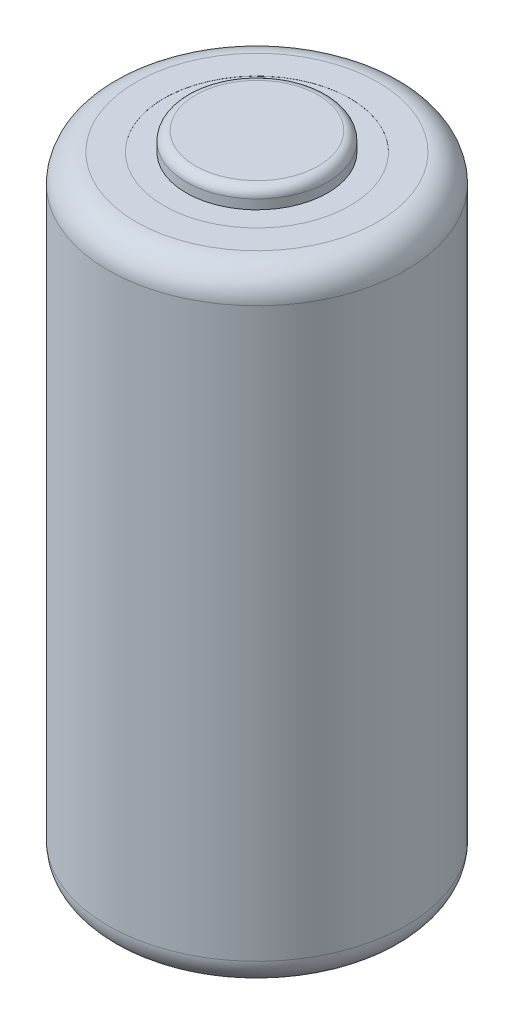
ISO-10303-21;
HEADER;
FILE_DESCRIPTION(('STEP AP214'),'2;1');
FILE_NAME('part.step','',(''),(''),'','','');
FILE_SCHEMA(('AUTOMOTIVE_DESIGN { 1 0 10303 214 1 1 1 1 }'));
ENDSEC;
DATA;
#1=APPLICATION_CONTEXT('core data for automotive mechanical design processes');
#2=APPLICATION_PROTOCOL_DEFINITION('international standard','automotive_design',2000,#1);
#3=PRODUCT_CONTEXT('',#1,'mechanical');
#4=PRODUCT('Part','Part','',(#3));
#5=PRODUCT_RELATED_PRODUCT_CATEGORY('part','',(#4));
#6=PRODUCT_DEFINITION_FORMATION('','',#4);
#7=PRODUCT_DEFINITION_CONTEXT('part definition',#1,'design');
#8=PRODUCT_DEFINITION('design','',#6,#7);
#9=PRODUCT_DEFINITION_SHAPE('','',#8);
#10=(LENGTH_UNIT() NAMED_UNIT(*) SI_UNIT(.MILLI.,.METRE.));
#11=(NAMED_UNIT(*) PLANE_ANGLE_UNIT() SI_UNIT($,.RADIAN.));
#12=(NAMED_UNIT(*) SI_UNIT($,.STERADIAN.) SOLID_ANGLE_UNIT());
#13=UNCERTAINTY_MEASURE_WITH_UNIT(LENGTH_MEASURE(1.E-05),#10,'distance_accuracy_value','');
#14=(GEOMETRIC_REPRESENTATION_CONTEXT(3) GLOBAL_UNCERTAINTY_ASSIGNED_CONTEXT((#13)) GLOBAL_UNIT_ASSIGNED_CONTEXT((#10,
#11,#12)) REPRESENTATION_CONTEXT('',''));
#15=CARTESIAN_POINT('',(0.,0.,0.));
#16=DIRECTION('',(0.,0.,1.));
#17=DIRECTION('',(1.,0.,0.));
#18=AXIS2_PLACEMENT_3D('',#15,#16,#17);
#19=CARTESIAN_POINT('',(0.,33.5,0.));
#20=DIRECTION('',(0.,1.,0.));
#21=DIRECTION('',(0.,0.,1.));
#22=AXIS2_PLACEMENT_3D('',#19,#20,#21);
#23=PLANE('',#22);
#24=CARTESIAN_POINT('',(0.,33.5,0.));
#25=DIRECTION('',(0.,1.,0.));
#26=DIRECTION('',(0.,0.,1.));
#27=AXIS2_PLACEMENT_3D('',#24,#25,#26);
#28=CIRCLE('',#27,5.);
#29=CARTESIAN_POINT('',(0.,33.5,5.));
#30=VERTEX_POINT('',#29);
#31=EDGE_CURVE('E73',#30,#30,#28,.T.);
#32=ORIENTED_EDGE('',*,*,#31,.F.);
#33=EDGE_LOOP('',(#32));
#34=FACE_BOUND('',#33,.T.);
#35=CARTESIAN_POINT('',(0.,33.5,0.));
#36=DIRECTION('',(0.,1.,0.));
#37=DIRECTION('',(0.,0.,1.));
#38=AXIS2_PLACEMENT_3D('',#35,#36,#37);
#39=CIRCLE('',#38,6.5);
#40=CARTESIAN_POINT('',(0.,33.5,6.5));
#41=VERTEX_POINT('',#40);
#42=EDGE_CURVE('E57',#41,#41,#39,.T.);
#43=ORIENTED_EDGE('',*,*,#42,.T.);
#44=EDGE_LOOP('',(#43));
#45=FACE_BOUND('',#44,.T.);
#46=ADVANCED_FACE('F46',(#34,#45),#23,.T.);
#47=CARTESIAN_POINT('',(0.,33.5,0.));
#48=DIRECTION('',(0.,-1.,0.));
#49=DIRECTION('',(0.,0.,-1.));
#50=AXIS2_PLACEMENT_3D('',#47,#48,#49);
#51=CYLINDRICAL_SURFACE('',#50,8.);
#52=CARTESIAN_POINT('',(0.,1.5,0.));
#53=DIRECTION('',(0.,1.,0.));
#54=DIRECTION('',(0.,0.,1.));
#55=AXIS2_PLACEMENT_3D('',#52,#53,#54);
#56=CIRCLE('',#55,8.);
#57=CARTESIAN_POINT('',(0.,1.5,8.));
#58=VERTEX_POINT('',#57);
#59=EDGE_CURVE('E66',#58,#58,#56,.T.);
#60=ORIENTED_EDGE('',*,*,#59,.T.);
#61=EDGE_LOOP('',(#60));
#62=FACE_BOUND('',#61,.T.);
#63=CARTESIAN_POINT('',(0.,32.,0.));
#64=DIRECTION('',(0.,1.,0.));
#65=DIRECTION('',(0.,0.,1.));
#66=AXIS2_PLACEMENT_3D('',#63,#64,#65);
#67=CIRCLE('',#66,8.);
#68=CARTESIAN_POINT('',(0.,32.,8.));
#69=VERTEX_POINT('',#68);
#70=EDGE_CURVE('E69',#69,#69,#67,.F.);
#71=ORIENTED_EDGE('',*,*,#70,.T.);
#72=EDGE_LOOP('',(#71));
#73=FACE_BOUND('',#72,.T.);
#74=ADVANCED_FACE('F100',(#62,#73),#51,.T.);
#75=CARTESIAN_POINT('',(0.,0.,0.));
#76=DIRECTION('',(0.,1.,0.));
#77=DIRECTION('',(0.,0.,1.));
#78=AXIS2_PLACEMENT_3D('',#75,#76,#77);
#79=PLANE('',#78);
#80=CARTESIAN_POINT('',(0.,0.,0.));
#81=DIRECTION('',(0.,1.,0.));
#82=DIRECTION('',(0.,0.,1.));
#83=AXIS2_PLACEMENT_3D('',#80,#81,#82);
#84=CIRCLE('',#83,6.5);
#85=CARTESIAN_POINT('',(0.,0.,6.5));
#86=VERTEX_POINT('',#85);
#87=EDGE_CURVE('E61',#86,#86,#84,.F.);
#88=ORIENTED_EDGE('',*,*,#87,.T.);
#89=EDGE_LOOP('',(#88));
#90=FACE_BOUND('',#89,.T.);
#91=ADVANCED_FACE('F110',(#90),#79,.F.);
#92=CARTESIAN_POINT('',(0.,1.5,0.));
#93=DIRECTION('',(0.,1.,0.));
#94=DIRECTION('',(0.,0.,1.));
#95=AXIS2_PLACEMENT_3D('',#92,#93,#94);
#96=TOROIDAL_SURFACE('',#95,6.5,1.5);
#97=ORIENTED_EDGE('',*,*,#87,.F.);
#98=EDGE_LOOP('',(#97));
#99=FACE_BOUND('',#98,.T.);
#100=ORIENTED_EDGE('',*,*,#59,.F.);
#101=EDGE_LOOP('',(#100));
#102=FACE_BOUND('',#101,.T.);
#103=ADVANCED_FACE('F105',(#99,#102),#96,.T.);
#104=CARTESIAN_POINT('',(0.,32.,0.));
#105=DIRECTION('',(0.,1.,0.));
#106=DIRECTION('',(0.,0.,1.));
#107=AXIS2_PLACEMENT_3D('',#104,#105,#106);
#108=TOROIDAL_SURFACE('',#107,6.5,1.5);
#109=ORIENTED_EDGE('',*,*,#70,.F.);
#110=EDGE_LOOP('',(#109));
#111=FACE_BOUND('',#110,.T.);
#112=ORIENTED_EDGE('',*,*,#42,.F.);
#113=EDGE_LOOP('',(#112));
#114=FACE_BOUND('',#113,.T.);
#115=ADVANCED_FACE('F94',(#111,#114),#108,.T.);
#116=CARTESIAN_POINT('',(0.,33.495,0.));
#117=DIRECTION('',(0.,1.,0.));
#118=DIRECTION('',(0.,0.,1.));
#119=AXIS2_PLACEMENT_3D('',#116,#117,#118);
#120=CYLINDRICAL_SURFACE('',#119,5.);
#121=CARTESIAN_POINT('',(0.,33.495,0.));
#122=DIRECTION('',(0.,1.,0.));
#123=DIRECTION('',(0.,0.,1.));
#124=AXIS2_PLACEMENT_3D('',#121,#122,#123);
#125=CIRCLE('',#124,5.);
#126=CARTESIAN_POINT('',(0.,33.495,5.));
#127=VERTEX_POINT('',#126);
#128=EDGE_CURVE('E72',#127,#127,#125,.T.);
#129=CARTESIAN_POINT('',(0.,33.495,5.));
#130=CARTESIAN_POINT('',(0.,33.4950520833333,5.));
#131=CARTESIAN_POINT('',(0.,33.4951041666667,5.));
#132=CARTESIAN_POINT('',(0.,33.4952083333333,5.));
#133=CARTESIAN_POINT('',(0.,33.4952604166667,5.));
#134=CARTESIAN_POINT('',(0.,33.4953645833333,5.));
#135=CARTESIAN_POINT('',(0.,33.4954166666667,5.));
#136=CARTESIAN_POINT('',(0.,33.4955208333333,5.));
#137=CARTESIAN_POINT('',(0.,33.4955729166667,5.));
#138=CARTESIAN_POINT('',(0.,33.4956770833333,5.));
#139=CARTESIAN_POINT('',(0.,33.4957291666667,5.));
#140=CARTESIAN_POINT('',(0.,33.4958333333333,5.));
#141=CARTESIAN_POINT('',(0.,33.4958854166667,5.));
#142=CARTESIAN_POINT('',(0.,33.4959895833333,5.));
#143=CARTESIAN_POINT('',(0.,33.4960416666667,5.));
#144=CARTESIAN_POINT('',(0.,33.4961458333333,5.));
#145=CARTESIAN_POINT('',(0.,33.4961979166667,5.));
#146=CARTESIAN_POINT('',(0.,33.4963020833333,5.));
#147=CARTESIAN_POINT('',(0.,33.4963541666667,5.));
#148=CARTESIAN_POINT('',(0.,33.4964583333333,5.));
#149=CARTESIAN_POINT('',(0.,33.4965104166667,5.));
#150=CARTESIAN_POINT('',(0.,33.4966145833333,5.));
#151=CARTESIAN_POINT('',(0.,33.4966666666667,5.));
#152=CARTESIAN_POINT('',(0.,33.4967708333333,5.));
#153=CARTESIAN_POINT('',(0.,33.4968229166667,5.));
#154=CARTESIAN_POINT('',(0.,33.4969270833333,5.));
#155=CARTESIAN_POINT('',(0.,33.4969791666667,5.));
#156=CARTESIAN_POINT('',(0.,33.4970833333333,5.));
#157=CARTESIAN_POINT('',(0.,33.4971354166667,5.));
#158=CARTESIAN_POINT('',(0.,33.4972395833333,5.));
#159=CARTESIAN_POINT('',(0.,33.4972916666667,5.));
#160=CARTESIAN_POINT('',(0.,33.4973958333333,5.));
#161=CARTESIAN_POINT('',(0.,33.4974479166667,5.));
#162=CARTESIAN_POINT('',(0.,33.4975520833333,5.));
#163=CARTESIAN_POINT('',(0.,33.4976041666667,5.));
#164=CARTESIAN_POINT('',(0.,33.4977083333333,5.));
#165=CARTESIAN_POINT('',(0.,33.4977604166667,5.));
#166=CARTESIAN_POINT('',(0.,33.4978645833333,5.));
#167=CARTESIAN_POINT('',(0.,33.4979166666667,5.));
#168=CARTESIAN_POINT('',(0.,33.4980208333333,5.));
#169=CARTESIAN_POINT('',(0.,33.4980729166667,5.));
#170=CARTESIAN_POINT('',(0.,33.4981770833333,5.));
#171=CARTESIAN_POINT('',(0.,33.4982291666667,5.));
#172=CARTESIAN_POINT('',(0.,33.4983333333333,5.));
#173=CARTESIAN_POINT('',(0.,33.4983854166667,5.));
#174=CARTESIAN_POINT('',(0.,33.4984895833333,5.));
#175=CARTESIAN_POINT('',(0.,33.4985416666667,5.));
#176=CARTESIAN_POINT('',(0.,33.4986458333333,5.));
#177=CARTESIAN_POINT('',(0.,33.4986979166667,5.));
#178=CARTESIAN_POINT('',(0.,33.4988020833333,5.));
#179=CARTESIAN_POINT('',(0.,33.4988541666667,5.));
#180=CARTESIAN_POINT('',(0.,33.4989583333333,5.));
#181=CARTESIAN_POINT('',(0.,33.4990104166667,5.));
#182=CARTESIAN_POINT('',(0.,33.4991145833333,5.));
#183=CARTESIAN_POINT('',(0.,33.4991666666667,5.));
#184=CARTESIAN_POINT('',(0.,33.4992708333333,5.));
#185=CARTESIAN_POINT('',(0.,33.4993229166667,5.));
#186=CARTESIAN_POINT('',(0.,33.4994270833333,5.));
#187=CARTESIAN_POINT('',(0.,33.4994791666667,5.));
#188=CARTESIAN_POINT('',(0.,33.4995833333333,5.));
#189=CARTESIAN_POINT('',(0.,33.4996354166667,5.));
#190=CARTESIAN_POINT('',(0.,33.4997395833333,5.));
#191=CARTESIAN_POINT('',(0.,33.4997916666667,5.));
#192=CARTESIAN_POINT('',(0.,33.4998958333333,5.));
#193=CARTESIAN_POINT('',(0.,33.4999479166667,5.));
#194=CARTESIAN_POINT('',(0.,33.5,5.));
#195=B_SPLINE_CURVE_WITH_KNOTS('',3,(#129,#130,#131,#132,#133,#134,#135,#136,#137,#138,#139,
#140,#141,#142,#143,#144,#145,#146,#147,#148,#149,#150,#151,#152,#153,#154,#155,#156,#157,#158,
#159,#160,#161,#162,#163,#164,#165,#166,#167,#168,#169,#170,#171,#172,#173,#174,#175,#176,#177,
#178,#179,#180,#181,#182,#183,#184,#185,#186,#187,#188,#189,#190,#191,#192,#193,#194),
.UNSPECIFIED.,.F.,.F.,(4,2,2,2,2,2,2,2,2,2,2,2,2,2,2,2,2,2,2,2,2,2,2,2,2,2,2,2,2,2,2,2,4),(0.,
0.000156250000001024,0.000312500000002047,0.000468750000003071,0.000625000000004095,
0.000781250000005118,0.000937500000006142,0.00109375000000023,0.00125000000000125,
0.00140625000000227,0.0015625000000033,0.00171875000000432,0.00187500000000534,
0.00203124999999943,0.00218750000000045,0.00234375000000148,0.0025000000000025,
0.00265625000000352,0.00281250000000455,0.00296875000000557,0.00312499999999966,
0.00328125000000068,0.0034375000000017,0.00359375000000273,0.00375000000000375,
0.00390625000000477,0.00406249999999886,0.00421874999999988,0.00437500000000091,
0.00453125000000193,0.00468750000000295,0.00484375000000398,0.00499999999999806),.UNSPECIFIED.);
#196=EDGE_CURVE('BSEAM88',#127,#30,#195,.T.);
#197=ORIENTED_EDGE('',*,*,#128,.F.);
#198=ORIENTED_EDGE('',*,*,#31,.T.);
#199=ORIENTED_EDGE('',*,*,#196,.T.);
#200=ORIENTED_EDGE('',*,*,#196,.F.);
#201=EDGE_LOOP('',(#197,#199,#198,#200));
#202=FACE_BOUND('',#201,.T.);
#203=ADVANCED_FACE('F88',(#202),#120,.F.);
#204=CARTESIAN_POINT('',(0.,33.495,0.));
#205=DIRECTION('',(0.,1.,0.));
#206=DIRECTION('',(0.,0.,1.));
#207=AXIS2_PLACEMENT_3D('',#204,#205,#206);
#208=PLANE('',#207);
#209=CARTESIAN_POINT('',(0.,33.495,0.));
#210=DIRECTION('',(0.,1.,0.));
#211=DIRECTION('',(0.,0.,1.));
#212=AXIS2_PLACEMENT_3D('',#209,#210,#211);
#213=CIRCLE('',#212,3.7999885534321);
#214=CARTESIAN_POINT('',(0.,33.495,3.7999885534321));
#215=VERTEX_POINT('',#214);
#216=EDGE_CURVE('E76',#215,#215,#213,.T.);
#217=ORIENTED_EDGE('',*,*,#216,.F.);
#218=EDGE_LOOP('',(#217));
#219=FACE_BOUND('',#218,.T.);
#220=ORIENTED_EDGE('',*,*,#128,.T.);
#221=EDGE_LOOP('',(#220));
#222=FACE_BOUND('',#221,.T.);
#223=ADVANCED_FACE('F84',(#219,#222),#208,.T.);
#224=CARTESIAN_POINT('',(0.,34.5,0.));
#225=DIRECTION('',(0.,1.,0.));
#226=DIRECTION('',(0.,0.,1.));
#227=AXIS2_PLACEMENT_3D('',#224,#225,#226);
#228=PLANE('',#227);
#229=CARTESIAN_POINT('',(0.,34.5,0.));
#230=DIRECTION('',(0.,1.,0.));
#231=DIRECTION('',(0.,0.,1.));
#232=AXIS2_PLACEMENT_3D('',#229,#230,#231);
#233=CIRCLE('',#232,3.2999885534321);
#234=CARTESIAN_POINT('',(0.,34.5,3.2999885534321));
#235=VERTEX_POINT('',#234);
#236=EDGE_CURVE('E53',#235,#235,#233,.T.);
#237=ORIENTED_EDGE('',*,*,#236,.T.);
#238=EDGE_LOOP('',(#237));
#239=FACE_BOUND('',#238,.T.);
#240=ADVANCED_FACE('F87',(#239),#228,.T.);
#241=CARTESIAN_POINT('',(0.,34.,0.));
#242=DIRECTION('',(0.,1.,0.));
#243=DIRECTION('',(0.,0.,1.));
#244=AXIS2_PLACEMENT_3D('',#241,#242,#243);
#245=TOROIDAL_SURFACE('',#244,3.2999885534321,0.5);
#246=CARTESIAN_POINT('',(0.,34.,0.));
#247=DIRECTION('',(0.,1.,0.));
#248=DIRECTION('',(0.,0.,1.));
#249=AXIS2_PLACEMENT_3D('',#246,#247,#248);
#250=CIRCLE('',#249,3.7999885534321);
#251=CARTESIAN_POINT('',(0.,34.,3.7999885534321));
#252=VERTEX_POINT('',#251);
#253=EDGE_CURVE('E12',#252,#252,#250,.F.);
#254=ORIENTED_EDGE('',*,*,#253,.F.);
#255=EDGE_LOOP('',(#254));
#256=FACE_BOUND('',#255,.T.);
#257=ORIENTED_EDGE('',*,*,#236,.F.);
#258=EDGE_LOOP('',(#257));
#259=FACE_BOUND('',#258,.T.);
#260=ADVANCED_FACE('F48',(#256,#259),#245,.T.);
#261=CARTESIAN_POINT('',(0.,34.5,0.));
#262=DIRECTION('',(0.,-1.,0.));
#263=DIRECTION('',(0.,0.,-1.));
#264=AXIS2_PLACEMENT_3D('',#261,#262,#263);
#265=CYLINDRICAL_SURFACE('',#264,3.7999885534321);
#266=ORIENTED_EDGE('',*,*,#253,.T.);
#267=EDGE_LOOP('',(#266));
#268=FACE_BOUND('',#267,.T.);
#269=ORIENTED_EDGE('',*,*,#216,.T.);
#270=EDGE_LOOP('',(#269));
#271=FACE_BOUND('',#270,.T.);
#272=ADVANCED_FACE('F82',(#268,#271),#265,.T.);
#273=CLOSED_SHELL('',(#46,#74,#91,#103,#115,#203,#223,#240,#260,#272));
#274=MANIFOLD_SOLID_BREP('B2',#273);
#275=ADVANCED_BREP_SHAPE_REPRESENTATION('',(#18,#274),#14);
#276=SHAPE_DEFINITION_REPRESENTATION(#9,#275);
ENDSEC;
END-ISO-10303-21;
